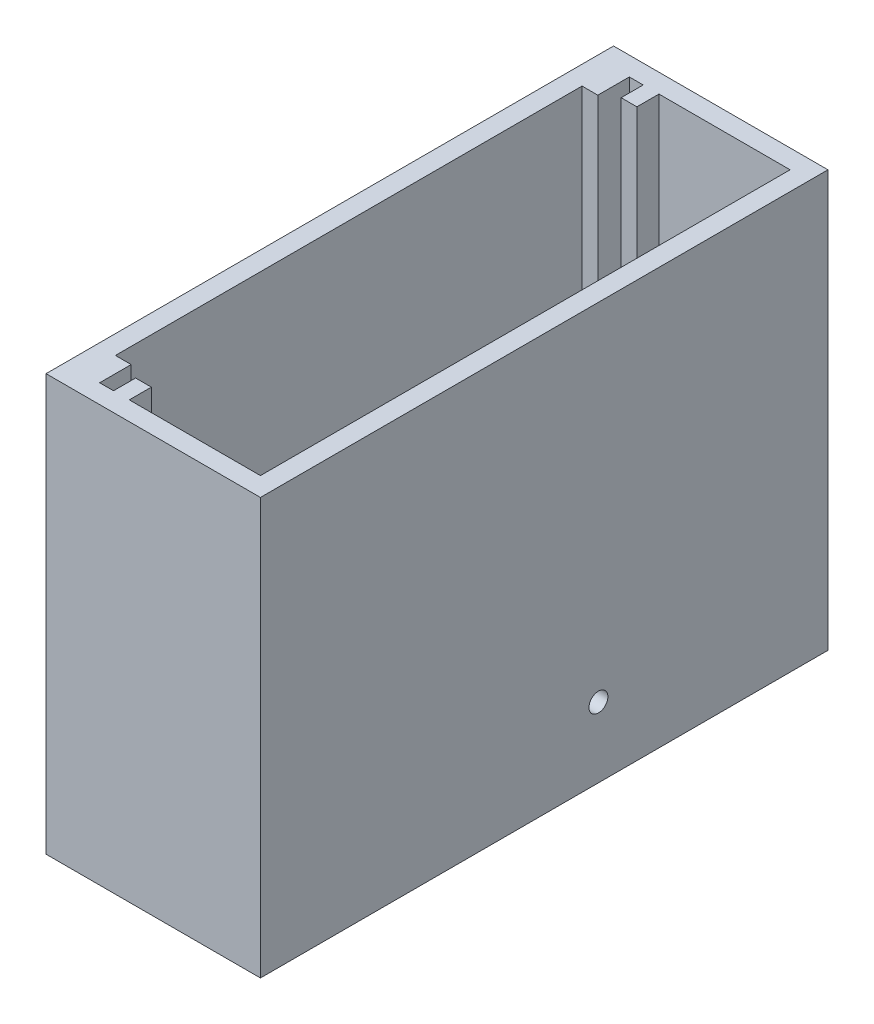
ISO-10303-21;
HEADER;
FILE_DESCRIPTION(('STEP AP214'),'2;1');
FILE_NAME('part.step','',(''),(''),'','','');
FILE_SCHEMA(('AUTOMOTIVE_DESIGN { 1 0 10303 214 1 1 1 1 }'));
ENDSEC;
DATA;
#1=APPLICATION_CONTEXT('core data for automotive mechanical design processes');
#2=APPLICATION_PROTOCOL_DEFINITION('international standard','automotive_design',2000,#1);
#3=PRODUCT_CONTEXT('',#1,'mechanical');
#4=PRODUCT('Part','Part','',(#3));
#5=PRODUCT_RELATED_PRODUCT_CATEGORY('part','',(#4));
#6=PRODUCT_DEFINITION_FORMATION('','',#4);
#7=PRODUCT_DEFINITION_CONTEXT('part definition',#1,'design');
#8=PRODUCT_DEFINITION('design','',#6,#7);
#9=PRODUCT_DEFINITION_SHAPE('','',#8);
#10=(LENGTH_UNIT() NAMED_UNIT(*) SI_UNIT(.MILLI.,.METRE.));
#11=(NAMED_UNIT(*) PLANE_ANGLE_UNIT() SI_UNIT($,.RADIAN.));
#12=(NAMED_UNIT(*) SI_UNIT($,.STERADIAN.) SOLID_ANGLE_UNIT());
#13=UNCERTAINTY_MEASURE_WITH_UNIT(LENGTH_MEASURE(1.E-05),#10,'distance_accuracy_value','');
#14=(GEOMETRIC_REPRESENTATION_CONTEXT(3) GLOBAL_UNCERTAINTY_ASSIGNED_CONTEXT((#13)) GLOBAL_UNIT_ASSIGNED_CONTEXT((#10,
#11,#12)) REPRESENTATION_CONTEXT('',''));
#15=CARTESIAN_POINT('',(0.,0.,0.));
#16=DIRECTION('',(0.,0.,1.));
#17=DIRECTION('',(1.,0.,0.));
#18=AXIS2_PLACEMENT_3D('',#15,#16,#17);
#19=CARTESIAN_POINT('',(0.,63.,-87.));
#20=DIRECTION('',(0.,0.,-1.));
#21=DIRECTION('',(-1.,0.,0.));
#22=AXIS2_PLACEMENT_3D('',#19,#20,#21);
#23=PLANE('',#22);
#24=DIRECTION('',(1.,0.,0.));
#25=VECTOR('',#24,1.);
#26=CARTESIAN_POINT('',(0.,0.,-87.));
#27=LINE('',#26,#25);
#28=CARTESIAN_POINT('',(5.49999999999995,0.,-87.));
#29=VERTEX_POINT('',#28);
#30=CARTESIAN_POINT('',(7.7,0.,-87.));
#31=VERTEX_POINT('',#30);
#32=EDGE_CURVE('E197',#29,#31,#27,.T.);
#33=ORIENTED_EDGE('',*,*,#32,.T.);
#34=DIRECTION('',(0.,-1.,0.));
#35=VECTOR('',#34,1.);
#36=CARTESIAN_POINT('',(7.7,63.,-87.));
#37=LINE('',#36,#35);
#38=CARTESIAN_POINT('',(7.7,63.,-87.));
#39=VERTEX_POINT('',#38);
#40=EDGE_CURVE('E11',#39,#31,#37,.T.);
#41=ORIENTED_EDGE('',*,*,#40,.F.);
#42=DIRECTION('',(1.,0.,0.));
#43=VECTOR('',#42,1.);
#44=CARTESIAN_POINT('',(0.,63.,-87.));
#45=LINE('',#44,#43);
#46=CARTESIAN_POINT('',(5.49999999999995,63.,-87.));
#47=VERTEX_POINT('',#46);
#48=EDGE_CURVE('E306',#47,#39,#45,.T.);
#49=ORIENTED_EDGE('',*,*,#48,.F.);
#50=DIRECTION('',(0.,-1.,0.));
#51=VECTOR('',#50,1.);
#52=CARTESIAN_POINT('',(5.49999999999995,63.,-87.));
#53=LINE('',#52,#51);
#54=EDGE_CURVE('E54',#47,#29,#53,.T.);
#55=ORIENTED_EDGE('',*,*,#54,.T.);
#56=EDGE_LOOP('',(#33,#41,#49,#55));
#57=FACE_BOUND('',#56,.T.);
#58=ADVANCED_FACE('F35',(#57),#23,.F.);
#59=CARTESIAN_POINT('',(7.7,63.,0.));
#60=DIRECTION('',(1.,0.,0.));
#61=DIRECTION('',(0.,0.,-1.));
#62=AXIS2_PLACEMENT_3D('',#59,#60,#61);
#63=PLANE('',#62);
#64=DIRECTION('',(0.,0.,1.));
#65=VECTOR('',#64,1.);
#66=CARTESIAN_POINT('',(7.7,0.,0.));
#67=LINE('',#66,#65);
#68=CARTESIAN_POINT('',(7.7,0.,-83.5));
#69=VERTEX_POINT('',#68);
#70=EDGE_CURVE('E199',#31,#69,#67,.T.);
#71=ORIENTED_EDGE('',*,*,#70,.T.);
#72=DIRECTION('',(0.,-1.,0.));
#73=VECTOR('',#72,1.);
#74=CARTESIAN_POINT('',(7.7,63.,-83.5));
#75=LINE('',#74,#73);
#76=CARTESIAN_POINT('',(7.7,63.,-83.5));
#77=VERTEX_POINT('',#76);
#78=EDGE_CURVE('E45',#77,#69,#75,.T.);
#79=ORIENTED_EDGE('',*,*,#78,.F.);
#80=DIRECTION('',(0.,0.,1.));
#81=VECTOR('',#80,1.);
#82=CARTESIAN_POINT('',(7.7,63.,0.));
#83=LINE('',#82,#81);
#84=EDGE_CURVE('E308',#39,#77,#83,.T.);
#85=ORIENTED_EDGE('',*,*,#84,.F.);
#86=ORIENTED_EDGE('',*,*,#40,.T.);
#87=EDGE_LOOP('',(#71,#79,#85,#86));
#88=FACE_BOUND('',#87,.T.);
#89=ADVANCED_FACE('F347',(#88),#63,.F.);
#90=CARTESIAN_POINT('',(0.,63.,-83.5));
#91=DIRECTION('',(0.,0.,-1.));
#92=DIRECTION('',(-1.,0.,0.));
#93=AXIS2_PLACEMENT_3D('',#90,#91,#92);
#94=PLANE('',#93);
#95=DIRECTION('',(1.,0.,0.));
#96=VECTOR('',#95,1.);
#97=CARTESIAN_POINT('',(0.,0.,-83.5));
#98=LINE('',#97,#96);
#99=CARTESIAN_POINT('',(10.2,0.,-83.5));
#100=VERTEX_POINT('',#99);
#101=EDGE_CURVE('E202',#69,#100,#98,.T.);
#102=ORIENTED_EDGE('',*,*,#101,.T.);
#103=DIRECTION('',(0.,-1.,0.));
#104=VECTOR('',#103,1.);
#105=CARTESIAN_POINT('',(10.2,63.,-83.5));
#106=LINE('',#105,#104);
#107=CARTESIAN_POINT('',(10.2,63.,-83.5));
#108=VERTEX_POINT('',#107);
#109=EDGE_CURVE('E263',#108,#100,#106,.T.);
#110=ORIENTED_EDGE('',*,*,#109,.F.);
#111=DIRECTION('',(1.,0.,0.));
#112=VECTOR('',#111,1.);
#113=CARTESIAN_POINT('',(0.,63.,-83.5));
#114=LINE('',#113,#112);
#115=EDGE_CURVE('E310',#77,#108,#114,.T.);
#116=ORIENTED_EDGE('',*,*,#115,.F.);
#117=ORIENTED_EDGE('',*,*,#78,.T.);
#118=EDGE_LOOP('',(#102,#110,#116,#117));
#119=FACE_BOUND('',#118,.T.);
#120=ADVANCED_FACE('F352',(#119),#94,.F.);
#121=CARTESIAN_POINT('',(10.2,63.,0.));
#122=DIRECTION('',(1.,0.,0.));
#123=DIRECTION('',(0.,0.,-1.));
#124=AXIS2_PLACEMENT_3D('',#121,#122,#123);
#125=PLANE('',#124);
#126=DIRECTION('',(0.,0.,1.));
#127=VECTOR('',#126,1.);
#128=CARTESIAN_POINT('',(10.2,0.,0.));
#129=LINE('',#128,#127);
#130=CARTESIAN_POINT('',(10.2,0.,-87.));
#131=VERTEX_POINT('',#130);
#132=EDGE_CURVE('E205',#131,#100,#129,.T.);
#133=ORIENTED_EDGE('',*,*,#132,.F.);
#134=DIRECTION('',(0.,-1.,0.));
#135=VECTOR('',#134,1.);
#136=CARTESIAN_POINT('',(10.2,63.,-87.));
#137=LINE('',#136,#135);
#138=CARTESIAN_POINT('',(10.2,63.,-87.));
#139=VERTEX_POINT('',#138);
#140=EDGE_CURVE('E261',#139,#131,#137,.T.);
#141=ORIENTED_EDGE('',*,*,#140,.F.);
#142=DIRECTION('',(0.,0.,1.));
#143=VECTOR('',#142,1.);
#144=CARTESIAN_POINT('',(10.2,63.,0.));
#145=LINE('',#144,#143);
#146=EDGE_CURVE('E312',#139,#108,#145,.T.);
#147=ORIENTED_EDGE('',*,*,#146,.T.);
#148=ORIENTED_EDGE('',*,*,#109,.T.);
#149=EDGE_LOOP('',(#133,#141,#147,#148));
#150=FACE_BOUND('',#149,.T.);
#151=ADVANCED_FACE('F358',(#150),#125,.T.);
#152=CARTESIAN_POINT('',(0.,63.,-87.));
#153=DIRECTION('',(0.,0.,-1.));
#154=DIRECTION('',(-1.,0.,0.));
#155=AXIS2_PLACEMENT_3D('',#152,#153,#154);
#156=PLANE('',#155);
#157=DIRECTION('',(1.,0.,0.));
#158=VECTOR('',#157,1.);
#159=CARTESIAN_POINT('',(0.,0.,-87.));
#160=LINE('',#159,#158);
#161=CARTESIAN_POINT('',(31.,0.,-87.));
#162=VERTEX_POINT('',#161);
#163=EDGE_CURVE('E208',#131,#162,#160,.T.);
#164=ORIENTED_EDGE('',*,*,#163,.T.);
#165=DIRECTION('',(0.,-1.,0.));
#166=VECTOR('',#165,1.);
#167=CARTESIAN_POINT('',(31.,63.,-87.));
#168=LINE('',#167,#166);
#169=CARTESIAN_POINT('',(31.,63.,-87.));
#170=VERTEX_POINT('',#169);
#171=EDGE_CURVE('E258',#170,#162,#168,.T.);
#172=ORIENTED_EDGE('',*,*,#171,.F.);
#173=DIRECTION('',(1.,0.,0.));
#174=VECTOR('',#173,1.);
#175=CARTESIAN_POINT('',(0.,63.,-87.));
#176=LINE('',#175,#174);
#177=EDGE_CURVE('E315',#139,#170,#176,.T.);
#178=ORIENTED_EDGE('',*,*,#177,.F.);
#179=ORIENTED_EDGE('',*,*,#140,.T.);
#180=EDGE_LOOP('',(#164,#172,#178,#179));
#181=FACE_BOUND('',#180,.T.);
#182=ADVANCED_FACE('F361',(#181),#156,.F.);
#183=CARTESIAN_POINT('',(31.,63.,0.));
#184=DIRECTION('',(1.,0.,0.));
#185=DIRECTION('',(0.,0.,-1.));
#186=AXIS2_PLACEMENT_3D('',#183,#184,#185);
#187=PLANE('',#186);
#188=CARTESIAN_POINT('',(31.,8.09999999999999,-53.6));
#189=DIRECTION('',(1.,0.,0.));
#190=DIRECTION('',(0.,0.,-1.));
#191=AXIS2_PLACEMENT_3D('',#188,#189,#190);
#192=CIRCLE('',#191,1.5);
#193=CARTESIAN_POINT('',(31.,8.09999999999999,-55.1));
#194=VERTEX_POINT('',#193);
#195=EDGE_CURVE('E421',#194,#194,#192,.T.);
#196=ORIENTED_EDGE('',*,*,#195,.T.);
#197=EDGE_LOOP('',(#196));
#198=FACE_BOUND('',#197,.T.);
#199=DIRECTION('',(0.,0.,1.));
#200=VECTOR('',#199,1.);
#201=CARTESIAN_POINT('',(31.,0.,0.));
#202=LINE('',#201,#200);
#203=CARTESIAN_POINT('',(31.,0.,-3.));
#204=VERTEX_POINT('',#203);
#205=EDGE_CURVE('E210',#162,#204,#202,.T.);
#206=ORIENTED_EDGE('',*,*,#205,.T.);
#207=DIRECTION('',(0.,-1.,0.));
#208=VECTOR('',#207,1.);
#209=CARTESIAN_POINT('',(31.,63.,-3.));
#210=LINE('',#209,#208);
#211=CARTESIAN_POINT('',(31.,63.,-3.));
#212=VERTEX_POINT('',#211);
#213=EDGE_CURVE('E256',#212,#204,#210,.T.);
#214=ORIENTED_EDGE('',*,*,#213,.F.);
#215=DIRECTION('',(0.,0.,1.));
#216=VECTOR('',#215,1.);
#217=CARTESIAN_POINT('',(31.,63.,0.));
#218=LINE('',#217,#216);
#219=EDGE_CURVE('E317',#170,#212,#218,.T.);
#220=ORIENTED_EDGE('',*,*,#219,.F.);
#221=ORIENTED_EDGE('',*,*,#171,.T.);
#222=EDGE_LOOP('',(#206,#214,#220,#221));
#223=FACE_BOUND('',#222,.T.);
#224=ADVANCED_FACE('F366',(#198,#223),#187,.F.);
#225=CARTESIAN_POINT('',(0.,63.,-3.));
#226=DIRECTION('',(0.,0.,-1.));
#227=DIRECTION('',(-1.,0.,0.));
#228=AXIS2_PLACEMENT_3D('',#225,#226,#227);
#229=PLANE('',#228);
#230=DIRECTION('',(1.,0.,0.));
#231=VECTOR('',#230,1.);
#232=CARTESIAN_POINT('',(0.,0.,-3.));
#233=LINE('',#232,#231);
#234=CARTESIAN_POINT('',(10.2,0.,-3.));
#235=VERTEX_POINT('',#234);
#236=EDGE_CURVE('E213',#235,#204,#233,.T.);
#237=ORIENTED_EDGE('',*,*,#236,.F.);
#238=DIRECTION('',(0.,-1.,0.));
#239=VECTOR('',#238,1.);
#240=CARTESIAN_POINT('',(10.2,63.,-3.));
#241=LINE('',#240,#239);
#242=CARTESIAN_POINT('',(10.2,63.,-3.));
#243=VERTEX_POINT('',#242);
#244=EDGE_CURVE('E254',#243,#235,#241,.T.);
#245=ORIENTED_EDGE('',*,*,#244,.F.);
#246=DIRECTION('',(1.,0.,0.));
#247=VECTOR('',#246,1.);
#248=CARTESIAN_POINT('',(0.,63.,-3.));
#249=LINE('',#248,#247);
#250=EDGE_CURVE('E319',#243,#212,#249,.T.);
#251=ORIENTED_EDGE('',*,*,#250,.T.);
#252=ORIENTED_EDGE('',*,*,#213,.T.);
#253=EDGE_LOOP('',(#237,#245,#251,#252));
#254=FACE_BOUND('',#253,.T.);
#255=ADVANCED_FACE('F373',(#254),#229,.T.);
#256=CARTESIAN_POINT('',(10.2,63.,0.));
#257=DIRECTION('',(-1.,0.,0.));
#258=DIRECTION('',(0.,0.,1.));
#259=AXIS2_PLACEMENT_3D('',#256,#257,#258);
#260=PLANE('',#259);
#261=DIRECTION('',(0.,0.,-1.));
#262=VECTOR('',#261,1.);
#263=CARTESIAN_POINT('',(10.2,0.,0.));
#264=LINE('',#263,#262);
#265=CARTESIAN_POINT('',(10.2,0.,-6.5));
#266=VERTEX_POINT('',#265);
#267=EDGE_CURVE('E216',#235,#266,#264,.T.);
#268=ORIENTED_EDGE('',*,*,#267,.T.);
#269=DIRECTION('',(0.,-1.,0.));
#270=VECTOR('',#269,1.);
#271=CARTESIAN_POINT('',(10.2,63.,-6.5));
#272=LINE('',#271,#270);
#273=CARTESIAN_POINT('',(10.2,63.,-6.5));
#274=VERTEX_POINT('',#273);
#275=EDGE_CURVE('E252',#274,#266,#272,.T.);
#276=ORIENTED_EDGE('',*,*,#275,.F.);
#277=DIRECTION('',(0.,0.,-1.));
#278=VECTOR('',#277,1.);
#279=CARTESIAN_POINT('',(10.2,63.,0.));
#280=LINE('',#279,#278);
#281=EDGE_CURVE('E322',#243,#274,#280,.T.);
#282=ORIENTED_EDGE('',*,*,#281,.F.);
#283=ORIENTED_EDGE('',*,*,#244,.T.);
#284=EDGE_LOOP('',(#268,#276,#282,#283));
#285=FACE_BOUND('',#284,.T.);
#286=ADVANCED_FACE('F376',(#285),#260,.F.);
#287=CARTESIAN_POINT('',(0.,63.,-6.5));
#288=DIRECTION('',(0.,0.,-1.));
#289=DIRECTION('',(-1.,0.,0.));
#290=AXIS2_PLACEMENT_3D('',#287,#288,#289);
#291=PLANE('',#290);
#292=DIRECTION('',(1.,0.,0.));
#293=VECTOR('',#292,1.);
#294=CARTESIAN_POINT('',(0.,0.,-6.5));
#295=LINE('',#294,#293);
#296=CARTESIAN_POINT('',(7.7,0.,-6.5));
#297=VERTEX_POINT('',#296);
#298=EDGE_CURVE('E219',#297,#266,#295,.T.);
#299=ORIENTED_EDGE('',*,*,#298,.F.);
#300=DIRECTION('',(0.,-1.,0.));
#301=VECTOR('',#300,1.);
#302=CARTESIAN_POINT('',(7.7,63.,-6.5));
#303=LINE('',#302,#301);
#304=CARTESIAN_POINT('',(7.7,63.,-6.5));
#305=VERTEX_POINT('',#304);
#306=EDGE_CURVE('E250',#305,#297,#303,.T.);
#307=ORIENTED_EDGE('',*,*,#306,.F.);
#308=DIRECTION('',(1.,0.,0.));
#309=VECTOR('',#308,1.);
#310=CARTESIAN_POINT('',(0.,63.,-6.5));
#311=LINE('',#310,#309);
#312=EDGE_CURVE('E324',#305,#274,#311,.T.);
#313=ORIENTED_EDGE('',*,*,#312,.T.);
#314=ORIENTED_EDGE('',*,*,#275,.T.);
#315=EDGE_LOOP('',(#299,#307,#313,#314));
#316=FACE_BOUND('',#315,.T.);
#317=ADVANCED_FACE('F379',(#316),#291,.T.);
#318=CARTESIAN_POINT('',(7.7,63.,0.));
#319=DIRECTION('',(-1.,0.,0.));
#320=DIRECTION('',(0.,0.,1.));
#321=AXIS2_PLACEMENT_3D('',#318,#319,#320);
#322=PLANE('',#321);
#323=DIRECTION('',(0.,0.,-1.));
#324=VECTOR('',#323,1.);
#325=CARTESIAN_POINT('',(7.7,0.,0.));
#326=LINE('',#325,#324);
#327=CARTESIAN_POINT('',(7.7,0.,-3.));
#328=VERTEX_POINT('',#327);
#329=EDGE_CURVE('E222',#328,#297,#326,.T.);
#330=ORIENTED_EDGE('',*,*,#329,.F.);
#331=DIRECTION('',(0.,-1.,0.));
#332=VECTOR('',#331,1.);
#333=CARTESIAN_POINT('',(7.7,63.,-3.));
#334=LINE('',#333,#332);
#335=CARTESIAN_POINT('',(7.7,63.,-3.));
#336=VERTEX_POINT('',#335);
#337=EDGE_CURVE('E248',#336,#328,#334,.T.);
#338=ORIENTED_EDGE('',*,*,#337,.F.);
#339=DIRECTION('',(0.,0.,-1.));
#340=VECTOR('',#339,1.);
#341=CARTESIAN_POINT('',(7.7,63.,0.));
#342=LINE('',#341,#340);
#343=EDGE_CURVE('E327',#336,#305,#342,.T.);
#344=ORIENTED_EDGE('',*,*,#343,.T.);
#345=ORIENTED_EDGE('',*,*,#306,.T.);
#346=EDGE_LOOP('',(#330,#338,#344,#345));
#347=FACE_BOUND('',#346,.T.);
#348=ADVANCED_FACE('F384',(#347),#322,.T.);
#349=CARTESIAN_POINT('',(0.,63.,-3.));
#350=DIRECTION('',(0.,0.,-1.));
#351=DIRECTION('',(-1.,0.,0.));
#352=AXIS2_PLACEMENT_3D('',#349,#350,#351);
#353=PLANE('',#352);
#354=DIRECTION('',(1.,0.,0.));
#355=VECTOR('',#354,1.);
#356=CARTESIAN_POINT('',(0.,0.,-3.));
#357=LINE('',#356,#355);
#358=CARTESIAN_POINT('',(5.5,0.,-3.));
#359=VERTEX_POINT('',#358);
#360=EDGE_CURVE('E225',#359,#328,#357,.T.);
#361=ORIENTED_EDGE('',*,*,#360,.F.);
#362=DIRECTION('',(0.,-1.,0.));
#363=VECTOR('',#362,1.);
#364=CARTESIAN_POINT('',(5.5,63.,-3.));
#365=LINE('',#364,#363);
#366=CARTESIAN_POINT('',(5.5,63.,-3.));
#367=VERTEX_POINT('',#366);
#368=EDGE_CURVE('E246',#367,#359,#365,.T.);
#369=ORIENTED_EDGE('',*,*,#368,.F.);
#370=DIRECTION('',(1.,0.,0.));
#371=VECTOR('',#370,1.);
#372=CARTESIAN_POINT('',(0.,63.,-3.));
#373=LINE('',#372,#371);
#374=EDGE_CURVE('E330',#367,#336,#373,.T.);
#375=ORIENTED_EDGE('',*,*,#374,.T.);
#376=ORIENTED_EDGE('',*,*,#337,.T.);
#377=EDGE_LOOP('',(#361,#369,#375,#376));
#378=FACE_BOUND('',#377,.T.);
#379=ADVANCED_FACE('F387',(#378),#353,.T.);
#380=CARTESIAN_POINT('',(5.5,63.,0.));
#381=DIRECTION('',(1.,0.,0.));
#382=DIRECTION('',(0.,0.,-1.));
#383=AXIS2_PLACEMENT_3D('',#380,#381,#382);
#384=PLANE('',#383);
#385=DIRECTION('',(0.,0.,1.));
#386=VECTOR('',#385,1.);
#387=CARTESIAN_POINT('',(5.5,0.,0.));
#388=LINE('',#387,#386);
#389=CARTESIAN_POINT('',(5.5,0.,-8.));
#390=VERTEX_POINT('',#389);
#391=EDGE_CURVE('E228',#390,#359,#388,.T.);
#392=ORIENTED_EDGE('',*,*,#391,.F.);
#393=DIRECTION('',(0.,-1.,0.));
#394=VECTOR('',#393,1.);
#395=CARTESIAN_POINT('',(5.5,63.,-8.));
#396=LINE('',#395,#394);
#397=CARTESIAN_POINT('',(5.5,63.,-8.));
#398=VERTEX_POINT('',#397);
#399=EDGE_CURVE('E244',#398,#390,#396,.T.);
#400=ORIENTED_EDGE('',*,*,#399,.F.);
#401=DIRECTION('',(0.,0.,1.));
#402=VECTOR('',#401,1.);
#403=CARTESIAN_POINT('',(5.5,63.,0.));
#404=LINE('',#403,#402);
#405=EDGE_CURVE('E333',#398,#367,#404,.T.);
#406=ORIENTED_EDGE('',*,*,#405,.T.);
#407=ORIENTED_EDGE('',*,*,#368,.T.);
#408=EDGE_LOOP('',(#392,#400,#406,#407));
#409=FACE_BOUND('',#408,.T.);
#410=ADVANCED_FACE('F389',(#409),#384,.T.);
#411=CARTESIAN_POINT('',(0.,63.,-8.));
#412=DIRECTION('',(0.,0.,-1.));
#413=DIRECTION('',(-1.,0.,0.));
#414=AXIS2_PLACEMENT_3D('',#411,#412,#413);
#415=PLANE('',#414);
#416=DIRECTION('',(1.,0.,0.));
#417=VECTOR('',#416,1.);
#418=CARTESIAN_POINT('',(0.,0.,-8.));
#419=LINE('',#418,#417);
#420=CARTESIAN_POINT('',(3.,0.,-8.));
#421=VERTEX_POINT('',#420);
#422=EDGE_CURVE('E231',#421,#390,#419,.T.);
#423=ORIENTED_EDGE('',*,*,#422,.F.);
#424=DIRECTION('',(0.,-1.,0.));
#425=VECTOR('',#424,1.);
#426=CARTESIAN_POINT('',(3.,63.,-8.));
#427=LINE('',#426,#425);
#428=CARTESIAN_POINT('',(3.,63.,-8.));
#429=VERTEX_POINT('',#428);
#430=EDGE_CURVE('E186',#429,#421,#427,.T.);
#431=ORIENTED_EDGE('',*,*,#430,.F.);
#432=DIRECTION('',(1.,0.,0.));
#433=VECTOR('',#432,1.);
#434=CARTESIAN_POINT('',(0.,63.,-8.));
#435=LINE('',#434,#433);
#436=EDGE_CURVE('E179',#429,#398,#435,.T.);
#437=ORIENTED_EDGE('',*,*,#436,.T.);
#438=ORIENTED_EDGE('',*,*,#399,.T.);
#439=EDGE_LOOP('',(#423,#431,#437,#438));
#440=FACE_BOUND('',#439,.T.);
#441=ADVANCED_FACE('F337',(#440),#415,.T.);
#442=CARTESIAN_POINT('',(3.00000000000001,63.,0.));
#443=DIRECTION('',(-1.,0.,0.));
#444=DIRECTION('',(0.,0.,1.));
#445=AXIS2_PLACEMENT_3D('',#442,#443,#444);
#446=PLANE('',#445);
#447=DIRECTION('',(0.,0.,-1.));
#448=VECTOR('',#447,1.);
#449=CARTESIAN_POINT('',(3.00000000000001,0.,0.));
#450=LINE('',#449,#448);
#451=CARTESIAN_POINT('',(2.99999999999994,0.,-82.));
#452=VERTEX_POINT('',#451);
#453=EDGE_CURVE('E104',#421,#452,#450,.T.);
#454=ORIENTED_EDGE('',*,*,#453,.T.);
#455=DIRECTION('',(0.,-1.,0.));
#456=VECTOR('',#455,1.);
#457=CARTESIAN_POINT('',(2.99999999999994,63.,-82.));
#458=LINE('',#457,#456);
#459=CARTESIAN_POINT('',(2.99999999999994,63.,-82.));
#460=VERTEX_POINT('',#459);
#461=EDGE_CURVE('E181',#460,#452,#458,.T.);
#462=ORIENTED_EDGE('',*,*,#461,.F.);
#463=DIRECTION('',(0.,0.,-1.));
#464=VECTOR('',#463,1.);
#465=CARTESIAN_POINT('',(3.00000000000001,63.,0.));
#466=LINE('',#465,#464);
#467=EDGE_CURVE('E170',#429,#460,#466,.T.);
#468=ORIENTED_EDGE('',*,*,#467,.F.);
#469=ORIENTED_EDGE('',*,*,#430,.T.);
#470=EDGE_LOOP('',(#454,#462,#468,#469));
#471=FACE_BOUND('',#470,.T.);
#472=ADVANCED_FACE('F182',(#471),#446,.F.);
#473=CARTESIAN_POINT('',(0.,63.,-82.));
#474=DIRECTION('',(0.,0.,-1.));
#475=DIRECTION('',(-1.,0.,0.));
#476=AXIS2_PLACEMENT_3D('',#473,#474,#475);
#477=PLANE('',#476);
#478=DIRECTION('',(1.,0.,0.));
#479=VECTOR('',#478,1.);
#480=CARTESIAN_POINT('',(0.,0.,-82.));
#481=LINE('',#480,#479);
#482=CARTESIAN_POINT('',(5.49999999999995,0.,-82.));
#483=VERTEX_POINT('',#482);
#484=EDGE_CURVE('E235',#452,#483,#481,.T.);
#485=ORIENTED_EDGE('',*,*,#484,.T.);
#486=DIRECTION('',(0.,-1.,0.));
#487=VECTOR('',#486,1.);
#488=CARTESIAN_POINT('',(5.49999999999995,63.,-82.));
#489=LINE('',#488,#487);
#490=CARTESIAN_POINT('',(5.49999999999995,63.,-82.));
#491=VERTEX_POINT('',#490);
#492=EDGE_CURVE('E187',#491,#483,#489,.T.);
#493=ORIENTED_EDGE('',*,*,#492,.F.);
#494=DIRECTION('',(1.,0.,0.));
#495=VECTOR('',#494,1.);
#496=CARTESIAN_POINT('',(0.,63.,-82.));
#497=LINE('',#496,#495);
#498=EDGE_CURVE('E175',#460,#491,#497,.T.);
#499=ORIENTED_EDGE('',*,*,#498,.F.);
#500=ORIENTED_EDGE('',*,*,#461,.T.);
#501=EDGE_LOOP('',(#485,#493,#499,#500));
#502=FACE_BOUND('',#501,.T.);
#503=ADVANCED_FACE('F189',(#502),#477,.F.);
#504=CARTESIAN_POINT('',(0.,63.,0.));
#505=DIRECTION('',(0.,0.,-1.));
#506=DIRECTION('',(-1.,0.,0.));
#507=AXIS2_PLACEMENT_3D('',#504,#505,#506);
#508=PLANE('',#507);
#509=DIRECTION('',(0.,-1.,0.));
#510=VECTOR('',#509,1.);
#511=CARTESIAN_POINT('',(0.,63.,0.));
#512=LINE('',#511,#510);
#513=CARTESIAN_POINT('',(0.,63.,0.));
#514=VERTEX_POINT('',#513);
#515=CARTESIAN_POINT('',(0.,-3.,0.));
#516=VERTEX_POINT('',#515);
#517=EDGE_CURVE('E193',#514,#516,#512,.T.);
#518=ORIENTED_EDGE('',*,*,#517,.T.);
#519=DIRECTION('',(-1.,0.,0.));
#520=VECTOR('',#519,1.);
#521=CARTESIAN_POINT('',(0.,-3.,0.));
#522=LINE('',#521,#520);
#523=CARTESIAN_POINT('',(34.,-3.,0.));
#524=VERTEX_POINT('',#523);
#525=EDGE_CURVE('E200',#524,#516,#522,.T.);
#526=ORIENTED_EDGE('',*,*,#525,.F.);
#527=DIRECTION('',(0.,-1.,0.));
#528=VECTOR('',#527,1.);
#529=CARTESIAN_POINT('',(34.,63.,0.));
#530=LINE('',#529,#528);
#531=CARTESIAN_POINT('',(34.,63.,0.));
#532=VERTEX_POINT('',#531);
#533=EDGE_CURVE('E39',#532,#524,#530,.T.);
#534=ORIENTED_EDGE('',*,*,#533,.F.);
#535=DIRECTION('',(1.,0.,0.));
#536=VECTOR('',#535,1.);
#537=CARTESIAN_POINT('',(0.,63.,0.));
#538=LINE('',#537,#536);
#539=EDGE_CURVE('E240',#514,#532,#538,.T.);
#540=ORIENTED_EDGE('',*,*,#539,.F.);
#541=EDGE_LOOP('',(#518,#526,#534,#540));
#542=FACE_BOUND('',#541,.T.);
#543=ADVANCED_FACE('F37',(#542),#508,.F.);
#544=CARTESIAN_POINT('',(34.,63.,0.));
#545=DIRECTION('',(-1.,0.,0.));
#546=DIRECTION('',(0.,0.,1.));
#547=AXIS2_PLACEMENT_3D('',#544,#545,#546);
#548=PLANE('',#547);
#549=CARTESIAN_POINT('',(34.,8.09999999999999,-53.6));
#550=DIRECTION('',(1.,0.,0.));
#551=DIRECTION('',(0.,0.,-1.));
#552=AXIS2_PLACEMENT_3D('',#549,#550,#551);
#553=CIRCLE('',#552,1.5);
#554=CARTESIAN_POINT('',(34.,8.09999999999999,-55.1));
#555=VERTEX_POINT('',#554);
#556=EDGE_CURVE('E419',#555,#555,#553,.T.);
#557=ORIENTED_EDGE('',*,*,#556,.F.);
#558=EDGE_LOOP('',(#557));
#559=FACE_BOUND('',#558,.T.);
#560=ORIENTED_EDGE('',*,*,#533,.T.);
#561=DIRECTION('',(0.,0.,1.));
#562=VECTOR('',#561,1.);
#563=CARTESIAN_POINT('',(34.,-3.,0.));
#564=LINE('',#563,#562);
#565=CARTESIAN_POINT('',(34.,-3.,-90.));
#566=VERTEX_POINT('',#565);
#567=EDGE_CURVE('E283',#566,#524,#564,.T.);
#568=ORIENTED_EDGE('',*,*,#567,.F.);
#569=DIRECTION('',(0.,-1.,0.));
#570=VECTOR('',#569,1.);
#571=CARTESIAN_POINT('',(34.,63.,-90.));
#572=LINE('',#571,#570);
#573=CARTESIAN_POINT('',(34.,63.,-90.));
#574=VERTEX_POINT('',#573);
#575=EDGE_CURVE('E271',#574,#566,#572,.T.);
#576=ORIENTED_EDGE('',*,*,#575,.F.);
#577=DIRECTION('',(0.,0.,-1.));
#578=VECTOR('',#577,1.);
#579=CARTESIAN_POINT('',(34.,63.,0.));
#580=LINE('',#579,#578);
#581=EDGE_CURVE('E116',#532,#574,#580,.T.);
#582=ORIENTED_EDGE('',*,*,#581,.F.);
#583=EDGE_LOOP('',(#560,#568,#576,#582));
#584=FACE_BOUND('',#583,.T.);
#585=ADVANCED_FACE('F282',(#559,#584),#548,.F.);
#586=CARTESIAN_POINT('',(0.,63.,-90.));
#587=DIRECTION('',(0.,0.,-1.));
#588=DIRECTION('',(-1.,0.,0.));
#589=AXIS2_PLACEMENT_3D('',#586,#587,#588);
#590=PLANE('',#589);
#591=ORIENTED_EDGE('',*,*,#575,.T.);
#592=DIRECTION('',(1.,0.,0.));
#593=VECTOR('',#592,1.);
#594=CARTESIAN_POINT('',(0.,-3.,-90.));
#595=LINE('',#594,#593);
#596=CARTESIAN_POINT('',(0.,-3.,-90.));
#597=VERTEX_POINT('',#596);
#598=EDGE_CURVE('E294',#597,#566,#595,.T.);
#599=ORIENTED_EDGE('',*,*,#598,.F.);
#600=DIRECTION('',(0.,-1.,0.));
#601=VECTOR('',#600,1.);
#602=CARTESIAN_POINT('',(0.,63.,-90.));
#603=LINE('',#602,#601);
#604=CARTESIAN_POINT('',(0.,63.,-90.));
#605=VERTEX_POINT('',#604);
#606=EDGE_CURVE('E269',#605,#597,#603,.T.);
#607=ORIENTED_EDGE('',*,*,#606,.F.);
#608=DIRECTION('',(1.,0.,0.));
#609=VECTOR('',#608,1.);
#610=CARTESIAN_POINT('',(0.,63.,-90.));
#611=LINE('',#610,#609);
#612=EDGE_CURVE('E301',#605,#574,#611,.T.);
#613=ORIENTED_EDGE('',*,*,#612,.T.);
#614=EDGE_LOOP('',(#591,#599,#607,#613));
#615=FACE_BOUND('',#614,.T.);
#616=ADVANCED_FACE('F409',(#615),#590,.T.);
#617=CARTESIAN_POINT('',(0.,63.,0.));
#618=DIRECTION('',(-1.,0.,0.));
#619=DIRECTION('',(0.,0.,1.));
#620=AXIS2_PLACEMENT_3D('',#617,#618,#619);
#621=PLANE('',#620);
#622=ORIENTED_EDGE('',*,*,#606,.T.);
#623=DIRECTION('',(0.,0.,-1.));
#624=VECTOR('',#623,1.);
#625=CARTESIAN_POINT('',(0.,-3.,0.));
#626=LINE('',#625,#624);
#627=EDGE_CURVE('E424',#516,#597,#626,.T.);
#628=ORIENTED_EDGE('',*,*,#627,.F.);
#629=ORIENTED_EDGE('',*,*,#517,.F.);
#630=DIRECTION('',(0.,0.,-1.));
#631=VECTOR('',#630,1.);
#632=CARTESIAN_POINT('',(0.,63.,0.));
#633=LINE('',#632,#631);
#634=EDGE_CURVE('E303',#514,#605,#633,.T.);
#635=ORIENTED_EDGE('',*,*,#634,.T.);
#636=EDGE_LOOP('',(#622,#628,#629,#635));
#637=FACE_BOUND('',#636,.T.);
#638=ADVANCED_FACE('F406',(#637),#621,.T.);
#639=CARTESIAN_POINT('',(5.49999999999995,63.,0.));
#640=DIRECTION('',(1.,0.,0.));
#641=DIRECTION('',(0.,0.,-1.));
#642=AXIS2_PLACEMENT_3D('',#639,#640,#641);
#643=PLANE('',#642);
#644=DIRECTION('',(0.,0.,1.));
#645=VECTOR('',#644,1.);
#646=CARTESIAN_POINT('',(5.49999999999995,0.,0.));
#647=LINE('',#646,#645);
#648=EDGE_CURVE('E237',#29,#483,#647,.T.);
#649=ORIENTED_EDGE('',*,*,#648,.F.);
#650=ORIENTED_EDGE('',*,*,#54,.F.);
#651=DIRECTION('',(0.,0.,1.));
#652=VECTOR('',#651,1.);
#653=CARTESIAN_POINT('',(5.49999999999995,63.,0.));
#654=LINE('',#653,#652);
#655=EDGE_CURVE('E191',#47,#491,#654,.T.);
#656=ORIENTED_EDGE('',*,*,#655,.T.);
#657=ORIENTED_EDGE('',*,*,#492,.T.);
#658=EDGE_LOOP('',(#649,#650,#656,#657));
#659=FACE_BOUND('',#658,.T.);
#660=ADVANCED_FACE('F343',(#659),#643,.T.);
#661=CARTESIAN_POINT('',(0.,63.,0.));
#662=DIRECTION('',(0.,1.,0.));
#663=DIRECTION('',(0.,0.,1.));
#664=AXIS2_PLACEMENT_3D('',#661,#662,#663);
#665=PLANE('',#664);
#666=ORIENTED_EDGE('',*,*,#539,.T.);
#667=ORIENTED_EDGE('',*,*,#581,.T.);
#668=ORIENTED_EDGE('',*,*,#612,.F.);
#669=ORIENTED_EDGE('',*,*,#634,.F.);
#670=EDGE_LOOP('',(#666,#667,#668,#669));
#671=FACE_BOUND('',#670,.T.);
#672=ORIENTED_EDGE('',*,*,#48,.T.);
#673=ORIENTED_EDGE('',*,*,#84,.T.);
#674=ORIENTED_EDGE('',*,*,#115,.T.);
#675=ORIENTED_EDGE('',*,*,#146,.F.);
#676=ORIENTED_EDGE('',*,*,#177,.T.);
#677=ORIENTED_EDGE('',*,*,#219,.T.);
#678=ORIENTED_EDGE('',*,*,#250,.F.);
#679=ORIENTED_EDGE('',*,*,#281,.T.);
#680=ORIENTED_EDGE('',*,*,#312,.F.);
#681=ORIENTED_EDGE('',*,*,#343,.F.);
#682=ORIENTED_EDGE('',*,*,#374,.F.);
#683=ORIENTED_EDGE('',*,*,#405,.F.);
#684=ORIENTED_EDGE('',*,*,#436,.F.);
#685=ORIENTED_EDGE('',*,*,#467,.T.);
#686=ORIENTED_EDGE('',*,*,#498,.T.);
#687=ORIENTED_EDGE('',*,*,#655,.F.);
#688=EDGE_LOOP('',(#672,#673,#674,#675,#676,#677,#678,#679,#680,#681,#682,#683,#684,#685,#686,#687));
#689=FACE_BOUND('',#688,.T.);
#690=ADVANCED_FACE('F172',(#671,#689),#665,.T.);
#691=CARTESIAN_POINT('',(0.,-3.,0.));
#692=DIRECTION('',(0.,-1.,0.));
#693=DIRECTION('',(0.,0.,-1.));
#694=AXIS2_PLACEMENT_3D('',#691,#692,#693);
#695=PLANE('',#694);
#696=ORIENTED_EDGE('',*,*,#627,.T.);
#697=ORIENTED_EDGE('',*,*,#598,.T.);
#698=ORIENTED_EDGE('',*,*,#567,.T.);
#699=ORIENTED_EDGE('',*,*,#525,.T.);
#700=EDGE_LOOP('',(#696,#697,#698,#699));
#701=FACE_BOUND('',#700,.T.);
#702=ADVANCED_FACE('F292',(#701),#695,.T.);
#703=CARTESIAN_POINT('',(0.,0.,0.));
#704=DIRECTION('',(0.,-1.,0.));
#705=DIRECTION('',(0.,0.,-1.));
#706=AXIS2_PLACEMENT_3D('',#703,#704,#705);
#707=PLANE('',#706);
#708=ORIENTED_EDGE('',*,*,#70,.F.);
#709=ORIENTED_EDGE('',*,*,#32,.F.);
#710=ORIENTED_EDGE('',*,*,#648,.T.);
#711=ORIENTED_EDGE('',*,*,#484,.F.);
#712=ORIENTED_EDGE('',*,*,#453,.F.);
#713=ORIENTED_EDGE('',*,*,#422,.T.);
#714=ORIENTED_EDGE('',*,*,#391,.T.);
#715=ORIENTED_EDGE('',*,*,#360,.T.);
#716=ORIENTED_EDGE('',*,*,#329,.T.);
#717=ORIENTED_EDGE('',*,*,#298,.T.);
#718=ORIENTED_EDGE('',*,*,#267,.F.);
#719=ORIENTED_EDGE('',*,*,#236,.T.);
#720=ORIENTED_EDGE('',*,*,#205,.F.);
#721=ORIENTED_EDGE('',*,*,#163,.F.);
#722=ORIENTED_EDGE('',*,*,#132,.T.);
#723=ORIENTED_EDGE('',*,*,#101,.F.);
#724=EDGE_LOOP('',(#708,#709,#710,#711,#712,#713,#714,#715,#716,#717,#718,#719,#720,#721,#722,#723));
#725=FACE_BOUND('',#724,.T.);
#726=ADVANCED_FACE('F341',(#725),#707,.F.);
#727=CARTESIAN_POINT('',(31.,8.09999999999999,-53.6));
#728=DIRECTION('',(1.,0.,0.));
#729=DIRECTION('',(0.,0.,-1.));
#730=AXIS2_PLACEMENT_3D('',#727,#728,#729);
#731=CYLINDRICAL_SURFACE('',#730,1.5);
#732=ORIENTED_EDGE('',*,*,#195,.F.);
#733=EDGE_LOOP('',(#732));
#734=FACE_BOUND('',#733,.T.);
#735=ORIENTED_EDGE('',*,*,#556,.T.);
#736=EDGE_LOOP('',(#735));
#737=FACE_BOUND('',#736,.T.);
#738=ADVANCED_FACE('F496',(#734,#737),#731,.F.);
#739=CLOSED_SHELL('',(#58,#89,#120,#151,#182,#224,#255,#286,#317,#348,#379,#410,#441,#472,#503,
#543,#585,#616,#638,#660,#690,#702,#726,#738));
#740=MANIFOLD_SOLID_BREP('B2',#739);
#741=ADVANCED_BREP_SHAPE_REPRESENTATION('',(#18,#740),#14);
#742=SHAPE_DEFINITION_REPRESENTATION(#9,#741);
ENDSEC;
END-ISO-10303-21;
